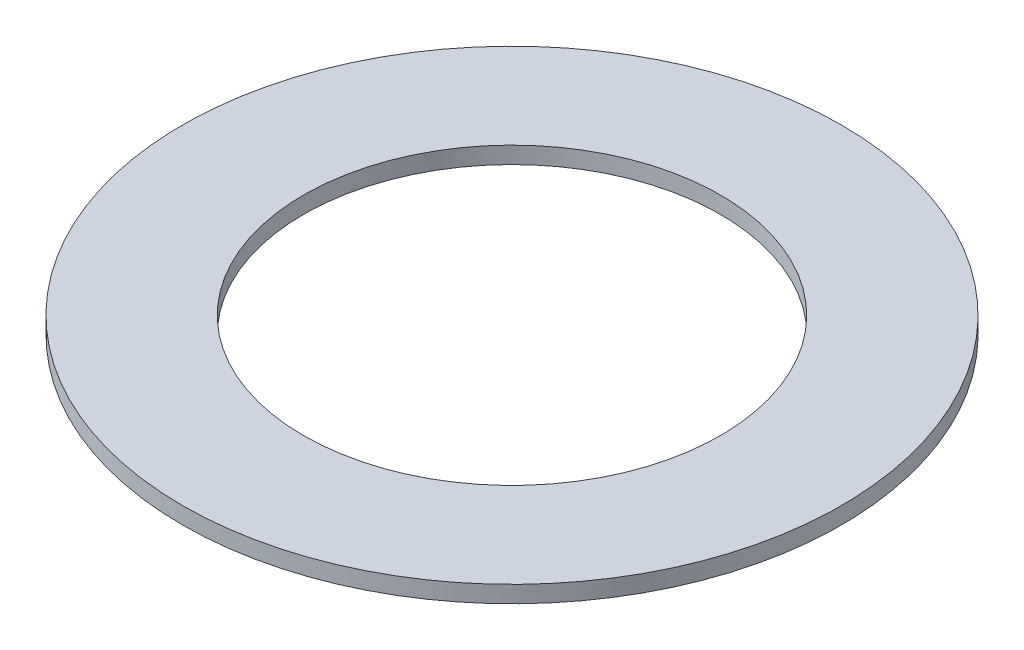
ISO-10303-21;
HEADER;
FILE_DESCRIPTION(('STEP AP214'),'2;1');
FILE_NAME('part.step','',(''),(''),'','','');
FILE_SCHEMA(('AUTOMOTIVE_DESIGN { 1 0 10303 214 1 1 1 1 }'));
ENDSEC;
DATA;
#1=APPLICATION_CONTEXT('core data for automotive mechanical design processes');
#2=APPLICATION_PROTOCOL_DEFINITION('international standard','automotive_design',2000,#1);
#3=PRODUCT_CONTEXT('',#1,'mechanical');
#4=PRODUCT('Part','Part','',(#3));
#5=PRODUCT_RELATED_PRODUCT_CATEGORY('part','',(#4));
#6=PRODUCT_DEFINITION_FORMATION('','',#4);
#7=PRODUCT_DEFINITION_CONTEXT('part definition',#1,'design');
#8=PRODUCT_DEFINITION('design','',#6,#7);
#9=PRODUCT_DEFINITION_SHAPE('','',#8);
#10=(LENGTH_UNIT() NAMED_UNIT(*) SI_UNIT(.MILLI.,.METRE.));
#11=(NAMED_UNIT(*) PLANE_ANGLE_UNIT() SI_UNIT($,.RADIAN.));
#12=(NAMED_UNIT(*) SI_UNIT($,.STERADIAN.) SOLID_ANGLE_UNIT());
#13=UNCERTAINTY_MEASURE_WITH_UNIT(LENGTH_MEASURE(1.E-05),#10,'distance_accuracy_value','');
#14=(GEOMETRIC_REPRESENTATION_CONTEXT(3) GLOBAL_UNCERTAINTY_ASSIGNED_CONTEXT((#13)) GLOBAL_UNIT_ASSIGNED_CONTEXT((#10,
#11,#12)) REPRESENTATION_CONTEXT('',''));
#15=CARTESIAN_POINT('',(0.,0.,0.));
#16=DIRECTION('',(0.,0.,1.));
#17=DIRECTION('',(1.,0.,0.));
#18=AXIS2_PLACEMENT_3D('',#15,#16,#17);
#19=CARTESIAN_POINT('',(0.,4.,0.));
#20=DIRECTION('',(0.,1.,0.));
#21=DIRECTION('',(0.,0.,1.));
#22=AXIS2_PLACEMENT_3D('',#19,#20,#21);
#23=PLANE('',#22);
#24=CARTESIAN_POINT('',(0.,4.,0.));
#25=DIRECTION('',(0.,1.,0.));
#26=DIRECTION('',(0.,0.,1.));
#27=AXIS2_PLACEMENT_3D('',#24,#25,#26);
#28=CIRCLE('',#27,78.35);
#29=CARTESIAN_POINT('',(0.,4.,78.35));
#30=VERTEX_POINT('',#29);
#31=EDGE_CURVE('E10',#30,#30,#28,.T.);
#32=ORIENTED_EDGE('',*,*,#31,.T.);
#33=EDGE_LOOP('',(#32));
#34=FACE_BOUND('',#33,.T.);
#35=CARTESIAN_POINT('',(0.,4.,0.));
#36=DIRECTION('',(0.,1.,0.));
#37=DIRECTION('',(0.,0.,1.));
#38=AXIS2_PLACEMENT_3D('',#35,#36,#37);
#39=CIRCLE('',#38,49.55);
#40=CARTESIAN_POINT('',(0.,4.,49.55));
#41=VERTEX_POINT('',#40);
#42=EDGE_CURVE('E52',#41,#41,#39,.T.);
#43=ORIENTED_EDGE('',*,*,#42,.F.);
#44=EDGE_LOOP('',(#43));
#45=FACE_BOUND('',#44,.T.);
#46=ADVANCED_FACE('F39',(#34,#45),#23,.T.);
#47=CARTESIAN_POINT('',(0.,0.,0.));
#48=DIRECTION('',(0.,1.,0.));
#49=DIRECTION('',(0.,0.,1.));
#50=AXIS2_PLACEMENT_3D('',#47,#48,#49);
#51=PLANE('',#50);
#52=CARTESIAN_POINT('',(0.,0.,0.));
#53=DIRECTION('',(0.,1.,0.));
#54=DIRECTION('',(0.,0.,1.));
#55=AXIS2_PLACEMENT_3D('',#52,#53,#54);
#56=CIRCLE('',#55,78.35);
#57=CARTESIAN_POINT('',(0.,0.,78.35));
#58=VERTEX_POINT('',#57);
#59=EDGE_CURVE('E43',#58,#58,#56,.T.);
#60=ORIENTED_EDGE('',*,*,#59,.F.);
#61=EDGE_LOOP('',(#60));
#62=FACE_BOUND('',#61,.T.);
#63=CARTESIAN_POINT('',(0.,0.,0.));
#64=DIRECTION('',(0.,1.,0.));
#65=DIRECTION('',(0.,0.,1.));
#66=AXIS2_PLACEMENT_3D('',#63,#64,#65);
#67=CIRCLE('',#66,49.55);
#68=CARTESIAN_POINT('',(0.,0.,49.55));
#69=VERTEX_POINT('',#68);
#70=EDGE_CURVE('E54',#69,#69,#67,.T.);
#71=ORIENTED_EDGE('',*,*,#70,.T.);
#72=EDGE_LOOP('',(#71));
#73=FACE_BOUND('',#72,.T.);
#74=ADVANCED_FACE('F66',(#62,#73),#51,.F.);
#75=CARTESIAN_POINT('',(0.,4.,0.));
#76=DIRECTION('',(0.,-1.,0.));
#77=DIRECTION('',(0.,0.,-1.));
#78=AXIS2_PLACEMENT_3D('',#75,#76,#77);
#79=CYLINDRICAL_SURFACE('',#78,78.35);
#80=ORIENTED_EDGE('',*,*,#31,.F.);
#81=EDGE_LOOP('',(#80));
#82=FACE_BOUND('',#81,.T.);
#83=ORIENTED_EDGE('',*,*,#59,.T.);
#84=EDGE_LOOP('',(#83));
#85=FACE_BOUND('',#84,.T.);
#86=ADVANCED_FACE('F41',(#82,#85),#79,.T.);
#87=CARTESIAN_POINT('',(0.,4.,0.));
#88=DIRECTION('',(0.,-1.,0.));
#89=DIRECTION('',(0.,0.,-1.));
#90=AXIS2_PLACEMENT_3D('',#87,#88,#89);
#91=CYLINDRICAL_SURFACE('',#90,49.55);
#92=ORIENTED_EDGE('',*,*,#42,.T.);
#93=EDGE_LOOP('',(#92));
#94=FACE_BOUND('',#93,.T.);
#95=ORIENTED_EDGE('',*,*,#70,.F.);
#96=EDGE_LOOP('',(#95));
#97=FACE_BOUND('',#96,.T.);
#98=ADVANCED_FACE('F62',(#94,#97),#91,.F.);
#99=CLOSED_SHELL('',(#46,#74,#86,#98));
#100=MANIFOLD_SOLID_BREP('B2',#99);
#101=ADVANCED_BREP_SHAPE_REPRESENTATION('',(#18,#100),#14);
#102=SHAPE_DEFINITION_REPRESENTATION(#9,#101);
ENDSEC;
END-ISO-10303-21;
